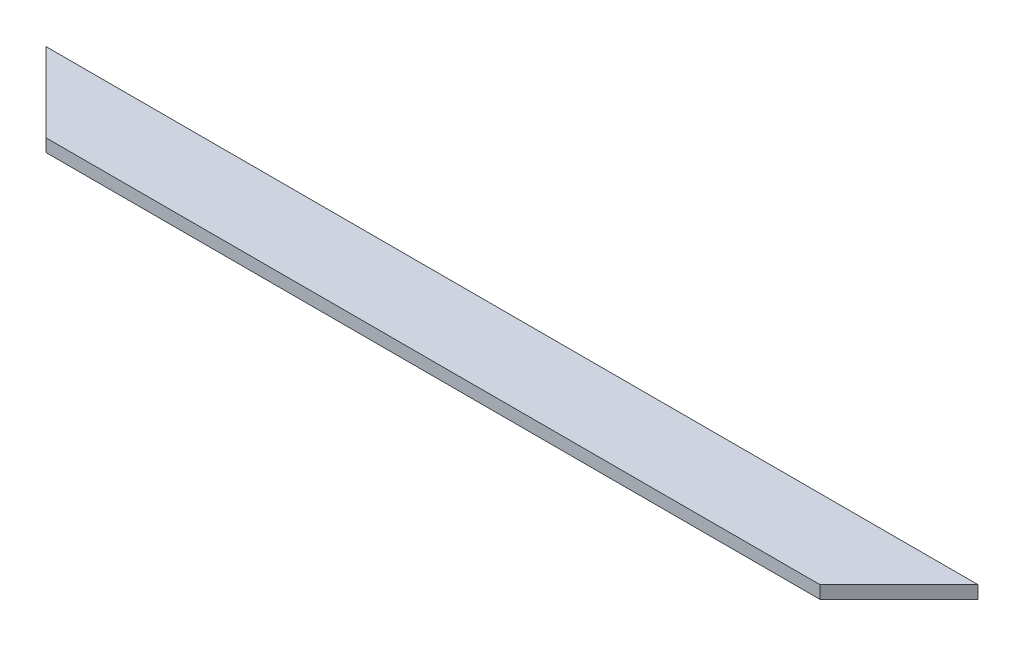
ISO-10303-21;
HEADER;
FILE_DESCRIPTION(('STEP AP214'),'2;1');
FILE_NAME('part.step','',(''),(''),'','','');
FILE_SCHEMA(('AUTOMOTIVE_DESIGN { 1 0 10303 214 1 1 1 1 }'));
ENDSEC;
DATA;
#1=APPLICATION_CONTEXT('core data for automotive mechanical design processes');
#2=APPLICATION_PROTOCOL_DEFINITION('international standard','automotive_design',2000,#1);
#3=PRODUCT_CONTEXT('',#1,'mechanical');
#4=PRODUCT('Part','Part','',(#3));
#5=PRODUCT_RELATED_PRODUCT_CATEGORY('part','',(#4));
#6=PRODUCT_DEFINITION_FORMATION('','',#4);
#7=PRODUCT_DEFINITION_CONTEXT('part definition',#1,'design');
#8=PRODUCT_DEFINITION('design','',#6,#7);
#9=PRODUCT_DEFINITION_SHAPE('','',#8);
#10=(LENGTH_UNIT() NAMED_UNIT(*) SI_UNIT(.MILLI.,.METRE.));
#11=(NAMED_UNIT(*) PLANE_ANGLE_UNIT() SI_UNIT($,.RADIAN.));
#12=(NAMED_UNIT(*) SI_UNIT($,.STERADIAN.) SOLID_ANGLE_UNIT());
#13=UNCERTAINTY_MEASURE_WITH_UNIT(LENGTH_MEASURE(1.E-05),#10,'distance_accuracy_value','');
#14=(GEOMETRIC_REPRESENTATION_CONTEXT(3) GLOBAL_UNCERTAINTY_ASSIGNED_CONTEXT((#13)) GLOBAL_UNIT_ASSIGNED_CONTEXT((#10,
#11,#12)) REPRESENTATION_CONTEXT('',''));
#15=CARTESIAN_POINT('',(0.,0.,0.));
#16=DIRECTION('',(0.,0.,1.));
#17=DIRECTION('',(1.,0.,0.));
#18=AXIS2_PLACEMENT_3D('',#15,#16,#17);
#19=CARTESIAN_POINT('',(-756.804260697991,21.59,-301.313725490196));
#20=DIRECTION('',(0.707106781186548,0.,-0.707106781186547));
#21=DIRECTION('',(-0.707106781186547,0.,-0.707106781186548));
#22=AXIS2_PLACEMENT_3D('',#19,#20,#21);
#23=PLANE('',#22);
#24=DIRECTION('',(0.707106781186547,0.,0.707106781186548));
#25=VECTOR('',#24,1.);
#26=CARTESIAN_POINT('',(-756.804260697991,0.,-301.313725490196));
#27=LINE('',#26,#25);
#28=CARTESIAN_POINT('',(-756.804260697991,0.,-301.313725490196));
#29=VERTEX_POINT('',#28);
#30=CARTESIAN_POINT('',(-623.45426069799,0.,-167.963725490196));
#31=VERTEX_POINT('',#30);
#32=EDGE_CURVE('E95',#29,#31,#27,.T.);
#33=ORIENTED_EDGE('',*,*,#32,.T.);
#34=DIRECTION('',(0.,-1.,0.));
#35=VECTOR('',#34,1.);
#36=CARTESIAN_POINT('',(-623.45426069799,21.59,-167.963725490196));
#37=LINE('',#36,#35);
#38=CARTESIAN_POINT('',(-623.45426069799,21.59,-167.963725490196));
#39=VERTEX_POINT('',#38);
#40=EDGE_CURVE('E11',#39,#31,#37,.T.);
#41=ORIENTED_EDGE('',*,*,#40,.F.);
#42=DIRECTION('',(0.707106781186547,0.,0.707106781186548));
#43=VECTOR('',#42,1.);
#44=CARTESIAN_POINT('',(-756.804260697991,21.59,-301.313725490196));
#45=LINE('',#44,#43);
#46=CARTESIAN_POINT('',(-756.804260697991,21.59,-301.313725490196));
#47=VERTEX_POINT('',#46);
#48=EDGE_CURVE('E83',#47,#39,#45,.T.);
#49=ORIENTED_EDGE('',*,*,#48,.F.);
#50=DIRECTION('',(0.,-1.,0.));
#51=VECTOR('',#50,1.);
#52=CARTESIAN_POINT('',(-756.804260697991,21.59,-301.313725490196));
#53=LINE('',#52,#51);
#54=EDGE_CURVE('E91',#47,#29,#53,.T.);
#55=ORIENTED_EDGE('',*,*,#54,.T.);
#56=EDGE_LOOP('',(#33,#41,#49,#55));
#57=FACE_BOUND('',#56,.T.);
#58=ADVANCED_FACE('F32',(#57),#23,.F.);
#59=CARTESIAN_POINT('',(-623.45426069799,21.59,-167.963725490196));
#60=DIRECTION('',(0.,0.,-1.));
#61=DIRECTION('',(-1.,0.,0.));
#62=AXIS2_PLACEMENT_3D('',#59,#60,#61);
#63=PLANE('',#62);
#64=DIRECTION('',(1.,0.,0.));
#65=VECTOR('',#64,1.);
#66=CARTESIAN_POINT('',(-623.45426069799,0.,-167.963725490196));
#67=LINE('',#66,#65);
#68=CARTESIAN_POINT('',(683.058239302009,0.,-167.963725490196));
#69=VERTEX_POINT('',#68);
#70=EDGE_CURVE('E87',#31,#69,#67,.T.);
#71=ORIENTED_EDGE('',*,*,#70,.T.);
#72=DIRECTION('',(0.,-1.,0.));
#73=VECTOR('',#72,1.);
#74=CARTESIAN_POINT('',(683.058239302009,21.59,-167.963725490196));
#75=LINE('',#74,#73);
#76=CARTESIAN_POINT('',(683.058239302009,21.59,-167.963725490196));
#77=VERTEX_POINT('',#76);
#78=EDGE_CURVE('E40',#77,#69,#75,.T.);
#79=ORIENTED_EDGE('',*,*,#78,.F.);
#80=DIRECTION('',(1.,0.,0.));
#81=VECTOR('',#80,1.);
#82=CARTESIAN_POINT('',(-623.45426069799,21.59,-167.963725490196));
#83=LINE('',#82,#81);
#84=EDGE_CURVE('E78',#39,#77,#83,.T.);
#85=ORIENTED_EDGE('',*,*,#84,.F.);
#86=ORIENTED_EDGE('',*,*,#40,.T.);
#87=EDGE_LOOP('',(#71,#79,#85,#86));
#88=FACE_BOUND('',#87,.T.);
#89=ADVANCED_FACE('F86',(#88),#63,.F.);
#90=CARTESIAN_POINT('',(816.408239302009,21.59,-301.313725490196));
#91=DIRECTION('',(-0.707106781186548,0.,-0.707106781186547));
#92=DIRECTION('',(-0.707106781186547,0.,0.707106781186548));
#93=AXIS2_PLACEMENT_3D('',#90,#91,#92);
#94=PLANE('',#93);
#95=DIRECTION('',(0.707106781186547,0.,-0.707106781186548));
#96=VECTOR('',#95,1.);
#97=CARTESIAN_POINT('',(816.408239302009,0.,-301.313725490196));
#98=LINE('',#97,#96);
#99=CARTESIAN_POINT('',(816.408239302009,0.,-301.313725490196));
#100=VERTEX_POINT('',#99);
#101=EDGE_CURVE('E65',#69,#100,#98,.T.);
#102=ORIENTED_EDGE('',*,*,#101,.T.);
#103=DIRECTION('',(0.,-1.,0.));
#104=VECTOR('',#103,1.);
#105=CARTESIAN_POINT('',(816.408239302009,21.59,-301.313725490196));
#106=LINE('',#105,#104);
#107=CARTESIAN_POINT('',(816.408239302009,21.59,-301.313725490196));
#108=VERTEX_POINT('',#107);
#109=EDGE_CURVE('E88',#108,#100,#106,.T.);
#110=ORIENTED_EDGE('',*,*,#109,.F.);
#111=DIRECTION('',(0.707106781186547,0.,-0.707106781186548));
#112=VECTOR('',#111,1.);
#113=CARTESIAN_POINT('',(816.408239302009,21.59,-301.313725490196));
#114=LINE('',#113,#112);
#115=EDGE_CURVE('E81',#77,#108,#114,.T.);
#116=ORIENTED_EDGE('',*,*,#115,.F.);
#117=ORIENTED_EDGE('',*,*,#78,.T.);
#118=EDGE_LOOP('',(#102,#110,#116,#117));
#119=FACE_BOUND('',#118,.T.);
#120=ADVANCED_FACE('F89',(#119),#94,.F.);
#121=CARTESIAN_POINT('',(-756.804260697991,21.59,-301.313725490196));
#122=DIRECTION('',(0.,0.,1.));
#123=DIRECTION('',(1.,0.,0.));
#124=AXIS2_PLACEMENT_3D('',#121,#122,#123);
#125=PLANE('',#124);
#126=DIRECTION('',(-1.,0.,0.));
#127=VECTOR('',#126,1.);
#128=CARTESIAN_POINT('',(-756.804260697991,0.,-301.313725490196));
#129=LINE('',#128,#127);
#130=EDGE_CURVE('E71',#100,#29,#129,.T.);
#131=ORIENTED_EDGE('',*,*,#130,.T.);
#132=ORIENTED_EDGE('',*,*,#54,.F.);
#133=DIRECTION('',(-1.,0.,0.));
#134=VECTOR('',#133,1.);
#135=CARTESIAN_POINT('',(-756.804260697991,21.59,-301.313725490196));
#136=LINE('',#135,#134);
#137=EDGE_CURVE('E48',#108,#47,#136,.T.);
#138=ORIENTED_EDGE('',*,*,#137,.F.);
#139=ORIENTED_EDGE('',*,*,#109,.T.);
#140=EDGE_LOOP('',(#131,#132,#138,#139));
#141=FACE_BOUND('',#140,.T.);
#142=ADVANCED_FACE('F102',(#141),#125,.F.);
#143=CARTESIAN_POINT('',(0.,21.59,0.));
#144=DIRECTION('',(0.,-1.,0.));
#145=DIRECTION('',(0.,0.,-1.));
#146=AXIS2_PLACEMENT_3D('',#143,#144,#145);
#147=PLANE('',#146);
#148=ORIENTED_EDGE('',*,*,#48,.T.);
#149=ORIENTED_EDGE('',*,*,#84,.T.);
#150=ORIENTED_EDGE('',*,*,#115,.T.);
#151=ORIENTED_EDGE('',*,*,#137,.T.);
#152=EDGE_LOOP('',(#148,#149,#150,#151));
#153=FACE_BOUND('',#152,.T.);
#154=ADVANCED_FACE('F79',(#153),#147,.F.);
#155=CARTESIAN_POINT('',(0.,0.,0.));
#156=DIRECTION('',(0.,-1.,0.));
#157=DIRECTION('',(0.,0.,-1.));
#158=AXIS2_PLACEMENT_3D('',#155,#156,#157);
#159=PLANE('',#158);
#160=ORIENTED_EDGE('',*,*,#32,.F.);
#161=ORIENTED_EDGE('',*,*,#130,.F.);
#162=ORIENTED_EDGE('',*,*,#101,.F.);
#163=ORIENTED_EDGE('',*,*,#70,.F.);
#164=EDGE_LOOP('',(#160,#161,#162,#163));
#165=FACE_BOUND('',#164,.T.);
#166=ADVANCED_FACE('F105',(#165),#159,.T.);
#167=CLOSED_SHELL('',(#58,#89,#120,#142,#154,#166));
#168=MANIFOLD_SOLID_BREP('B2',#167);
#169=ADVANCED_BREP_SHAPE_REPRESENTATION('',(#18,#168),#14);
#170=SHAPE_DEFINITION_REPRESENTATION(#9,#169);
ENDSEC;
END-ISO-10303-21;
